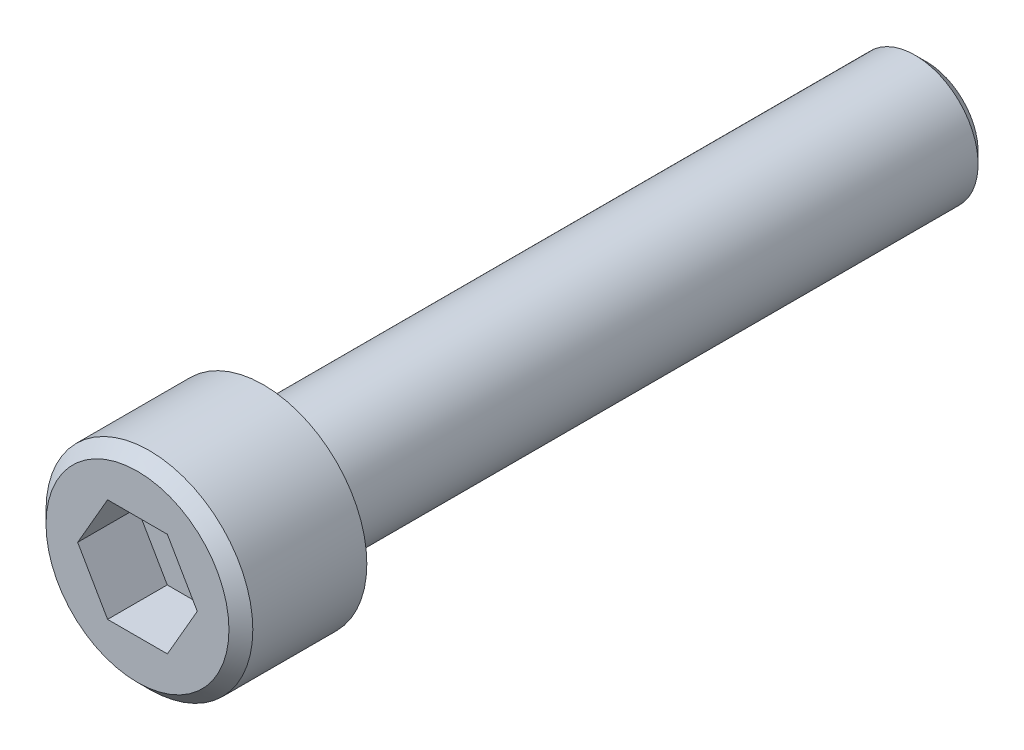
ISO-10303-21;
HEADER;
FILE_DESCRIPTION(('STEP AP214'),'2;1');
FILE_NAME('part.step','',(''),(''),'','','');
FILE_SCHEMA(('AUTOMOTIVE_DESIGN { 1 0 10303 214 1 1 1 1 }'));
ENDSEC;
DATA;
#1=APPLICATION_CONTEXT('core data for automotive mechanical design processes');
#2=APPLICATION_PROTOCOL_DEFINITION('international standard','automotive_design',2000,#1);
#3=PRODUCT_CONTEXT('',#1,'mechanical');
#4=PRODUCT('Part','Part','',(#3));
#5=PRODUCT_RELATED_PRODUCT_CATEGORY('part','',(#4));
#6=PRODUCT_DEFINITION_FORMATION('','',#4);
#7=PRODUCT_DEFINITION_CONTEXT('part definition',#1,'design');
#8=PRODUCT_DEFINITION('design','',#6,#7);
#9=PRODUCT_DEFINITION_SHAPE('','',#8);
#10=(LENGTH_UNIT() NAMED_UNIT(*) SI_UNIT(.MILLI.,.METRE.));
#11=(NAMED_UNIT(*) PLANE_ANGLE_UNIT() SI_UNIT($,.RADIAN.));
#12=(NAMED_UNIT(*) SI_UNIT($,.STERADIAN.) SOLID_ANGLE_UNIT());
#13=UNCERTAINTY_MEASURE_WITH_UNIT(LENGTH_MEASURE(1.E-05),#10,'distance_accuracy_value','');
#14=(GEOMETRIC_REPRESENTATION_CONTEXT(3) GLOBAL_UNCERTAINTY_ASSIGNED_CONTEXT((#13)) GLOBAL_UNIT_ASSIGNED_CONTEXT((#10,
#11,#12)) REPRESENTATION_CONTEXT('',''));
#15=CARTESIAN_POINT('',(0.,0.,0.));
#16=DIRECTION('',(0.,0.,1.));
#17=DIRECTION('',(1.,0.,0.));
#18=AXIS2_PLACEMENT_3D('',#15,#16,#17);
#19=CARTESIAN_POINT('',(0.,0.,4.826));
#20=DIRECTION('',(0.,0.,-1.));
#21=DIRECTION('',(-1.,0.,0.));
#22=AXIS2_PLACEMENT_3D('',#19,#20,#21);
#23=CYLINDRICAL_SURFACE('',#22,3.9624);
#24=CARTESIAN_POINT('',(0.,0.,4.3688));
#25=DIRECTION('',(0.,0.,1.));
#26=DIRECTION('',(1.,0.,0.));
#27=AXIS2_PLACEMENT_3D('',#24,#25,#26);
#28=CIRCLE('',#27,3.9624);
#29=CARTESIAN_POINT('',(3.9624,0.,4.3688));
#30=VERTEX_POINT('',#29);
#31=EDGE_CURVE('E147',#30,#30,#28,.F.);
#32=ORIENTED_EDGE('',*,*,#31,.T.);
#33=EDGE_LOOP('',(#32));
#34=FACE_BOUND('',#33,.T.);
#35=CARTESIAN_POINT('',(0.,0.,0.));
#36=DIRECTION('',(0.,0.,1.));
#37=DIRECTION('',(1.,0.,0.));
#38=AXIS2_PLACEMENT_3D('',#35,#36,#37);
#39=CIRCLE('',#38,3.9624);
#40=CARTESIAN_POINT('',(3.9624,0.,0.));
#41=VERTEX_POINT('',#40);
#42=EDGE_CURVE('E139',#41,#41,#39,.T.);
#43=ORIENTED_EDGE('',*,*,#42,.T.);
#44=EDGE_LOOP('',(#43));
#45=FACE_BOUND('',#44,.T.);
#46=ADVANCED_FACE('F17',(#34,#45),#23,.T.);
#47=CARTESIAN_POINT('',(0.,0.,4.826));
#48=DIRECTION('',(0.,0.,1.));
#49=DIRECTION('',(1.,0.,0.));
#50=AXIS2_PLACEMENT_3D('',#47,#48,#49);
#51=PLANE('',#50);
#52=CARTESIAN_POINT('',(0.,0.,4.826));
#53=DIRECTION('',(0.,0.,1.));
#54=DIRECTION('',(1.,0.,0.));
#55=AXIS2_PLACEMENT_3D('',#52,#53,#54);
#56=CIRCLE('',#55,3.5052);
#57=CARTESIAN_POINT('',(3.5052,0.,4.826));
#58=VERTEX_POINT('',#57);
#59=EDGE_CURVE('E143',#58,#58,#56,.T.);
#60=ORIENTED_EDGE('',*,*,#59,.T.);
#61=EDGE_LOOP('',(#60));
#62=FACE_BOUND('',#61,.T.);
#63=DIRECTION('',(-0.5,0.866025403784439,0.));
#64=VECTOR('',#63,1.);
#65=CARTESIAN_POINT('',(1.71851916063474,0.9921875,4.826));
#66=LINE('',#65,#64);
#67=CARTESIAN_POINT('',(2.29135888084633,0.,4.826));
#68=VERTEX_POINT('',#67);
#69=CARTESIAN_POINT('',(1.14567944042316,1.984375,4.826));
#70=VERTEX_POINT('',#69);
#71=EDGE_CURVE('E110',#68,#70,#66,.T.);
#72=ORIENTED_EDGE('',*,*,#71,.F.);
#73=DIRECTION('',(0.5,0.866025403784439,0.));
#74=VECTOR('',#73,1.);
#75=CARTESIAN_POINT('',(1.71851916063474,-0.9921875,4.826));
#76=LINE('',#75,#74);
#77=CARTESIAN_POINT('',(1.14567944042316,-1.984375,4.826));
#78=VERTEX_POINT('',#77);
#79=EDGE_CURVE('E125',#78,#68,#76,.T.);
#80=ORIENTED_EDGE('',*,*,#79,.F.);
#81=DIRECTION('',(1.,0.,0.));
#82=VECTOR('',#81,1.);
#83=CARTESIAN_POINT('',(0.,-1.984375,4.826));
#84=LINE('',#83,#82);
#85=CARTESIAN_POINT('',(-1.14567944042316,-1.984375,4.826));
#86=VERTEX_POINT('',#85);
#87=EDGE_CURVE('E34',#86,#78,#84,.T.);
#88=ORIENTED_EDGE('',*,*,#87,.F.);
#89=DIRECTION('',(0.5,-0.866025403784439,0.));
#90=VECTOR('',#89,1.);
#91=CARTESIAN_POINT('',(-1.71851916063474,-0.9921875,4.826));
#92=LINE('',#91,#90);
#93=CARTESIAN_POINT('',(-2.29135888084633,0.,4.826));
#94=VERTEX_POINT('',#93);
#95=EDGE_CURVE('E83',#94,#86,#92,.T.);
#96=ORIENTED_EDGE('',*,*,#95,.F.);
#97=DIRECTION('',(-0.5,-0.866025403784439,0.));
#98=VECTOR('',#97,1.);
#99=CARTESIAN_POINT('',(-1.71851916063474,0.9921875,4.826));
#100=LINE('',#99,#98);
#101=CARTESIAN_POINT('',(-1.14567944042316,1.984375,4.826));
#102=VERTEX_POINT('',#101);
#103=EDGE_CURVE('E117',#102,#94,#100,.T.);
#104=ORIENTED_EDGE('',*,*,#103,.F.);
#105=DIRECTION('',(-1.,0.,0.));
#106=VECTOR('',#105,1.);
#107=CARTESIAN_POINT('',(0.,1.984375,4.826));
#108=LINE('',#107,#106);
#109=EDGE_CURVE('E113',#70,#102,#108,.T.);
#110=ORIENTED_EDGE('',*,*,#109,.F.);
#111=EDGE_LOOP('',(#72,#80,#88,#96,#104,#110));
#112=FACE_BOUND('',#111,.T.);
#113=ADVANCED_FACE('F175',(#62,#112),#51,.T.);
#114=CARTESIAN_POINT('',(0.,0.,0.));
#115=DIRECTION('',(0.,0.,1.));
#116=DIRECTION('',(1.,0.,0.));
#117=AXIS2_PLACEMENT_3D('',#114,#115,#116);
#118=PLANE('',#117);
#119=CARTESIAN_POINT('',(0.,0.,0.));
#120=DIRECTION('',(0.,0.,-1.));
#121=DIRECTION('',(-1.,0.,0.));
#122=AXIS2_PLACEMENT_3D('',#119,#120,#121);
#123=CIRCLE('',#122,2.413);
#124=CARTESIAN_POINT('',(-2.413,0.,0.));
#125=VERTEX_POINT('',#124);
#126=EDGE_CURVE('E150',#125,#125,#123,.T.);
#127=ORIENTED_EDGE('',*,*,#126,.F.);
#128=EDGE_LOOP('',(#127));
#129=FACE_BOUND('',#128,.T.);
#130=ORIENTED_EDGE('',*,*,#42,.F.);
#131=EDGE_LOOP('',(#130));
#132=FACE_BOUND('',#131,.T.);
#133=ADVANCED_FACE('F181',(#129,#132),#118,.F.);
#134=CARTESIAN_POINT('',(1.71851916063474,0.9921875,2.54));
#135=DIRECTION('',(0.866025403784439,0.5,0.));
#136=DIRECTION('',(-0.5,0.866025403784439,0.));
#137=AXIS2_PLACEMENT_3D('',#134,#135,#136);
#138=PLANE('',#137);
#139=ORIENTED_EDGE('',*,*,#71,.T.);
#140=DIRECTION('',(0.,0.,1.));
#141=VECTOR('',#140,1.);
#142=CARTESIAN_POINT('',(1.14567944042316,1.984375,2.54));
#143=LINE('',#142,#141);
#144=CARTESIAN_POINT('',(1.14567944042316,1.984375,2.54));
#145=VERTEX_POINT('',#144);
#146=EDGE_CURVE('E67',#145,#70,#143,.T.);
#147=ORIENTED_EDGE('',*,*,#146,.F.);
#148=DIRECTION('',(-0.5,0.866025403784439,0.));
#149=VECTOR('',#148,1.);
#150=CARTESIAN_POINT('',(1.71851916063474,0.9921875,2.54));
#151=LINE('',#150,#149);
#152=CARTESIAN_POINT('',(2.29135888084633,0.,2.54));
#153=VERTEX_POINT('',#152);
#154=EDGE_CURVE('E127',#153,#145,#151,.T.);
#155=ORIENTED_EDGE('',*,*,#154,.F.);
#156=DIRECTION('',(0.,0.,1.));
#157=VECTOR('',#156,1.);
#158=CARTESIAN_POINT('',(2.29135888084633,0.,2.54));
#159=LINE('',#158,#157);
#160=EDGE_CURVE('E43',#153,#68,#159,.T.);
#161=ORIENTED_EDGE('',*,*,#160,.T.);
#162=EDGE_LOOP('',(#139,#147,#155,#161));
#163=FACE_BOUND('',#162,.T.);
#164=ADVANCED_FACE('F178',(#163),#138,.F.);
#165=CARTESIAN_POINT('',(0.,1.984375,2.54));
#166=DIRECTION('',(0.,1.,0.));
#167=DIRECTION('',(0.,0.,1.));
#168=AXIS2_PLACEMENT_3D('',#165,#166,#167);
#169=PLANE('',#168);
#170=ORIENTED_EDGE('',*,*,#109,.T.);
#171=DIRECTION('',(0.,0.,1.));
#172=VECTOR('',#171,1.);
#173=CARTESIAN_POINT('',(-1.14567944042316,1.984375,2.54));
#174=LINE('',#173,#172);
#175=CARTESIAN_POINT('',(-1.14567944042316,1.984375,2.54));
#176=VERTEX_POINT('',#175);
#177=EDGE_CURVE('E134',#176,#102,#174,.T.);
#178=ORIENTED_EDGE('',*,*,#177,.F.);
#179=DIRECTION('',(-1.,0.,0.));
#180=VECTOR('',#179,1.);
#181=CARTESIAN_POINT('',(0.,1.984375,2.54));
#182=LINE('',#181,#180);
#183=EDGE_CURVE('E163',#145,#176,#182,.T.);
#184=ORIENTED_EDGE('',*,*,#183,.F.);
#185=ORIENTED_EDGE('',*,*,#146,.T.);
#186=EDGE_LOOP('',(#170,#178,#184,#185));
#187=FACE_BOUND('',#186,.T.);
#188=ADVANCED_FACE('F180',(#187),#169,.F.);
#189=CARTESIAN_POINT('',(-1.71851916063474,0.9921875,2.54));
#190=DIRECTION('',(-0.866025403784439,0.5,0.));
#191=DIRECTION('',(-0.5,-0.866025403784439,0.));
#192=AXIS2_PLACEMENT_3D('',#189,#190,#191);
#193=PLANE('',#192);
#194=ORIENTED_EDGE('',*,*,#103,.T.);
#195=DIRECTION('',(0.,0.,1.));
#196=VECTOR('',#195,1.);
#197=CARTESIAN_POINT('',(-2.29135888084633,0.,2.54));
#198=LINE('',#197,#196);
#199=CARTESIAN_POINT('',(-2.29135888084633,0.,2.54));
#200=VERTEX_POINT('',#199);
#201=EDGE_CURVE('E86',#200,#94,#198,.T.);
#202=ORIENTED_EDGE('',*,*,#201,.F.);
#203=DIRECTION('',(-0.5,-0.866025403784439,0.));
#204=VECTOR('',#203,1.);
#205=CARTESIAN_POINT('',(-1.71851916063474,0.9921875,2.54));
#206=LINE('',#205,#204);
#207=EDGE_CURVE('E97',#176,#200,#206,.T.);
#208=ORIENTED_EDGE('',*,*,#207,.F.);
#209=ORIENTED_EDGE('',*,*,#177,.T.);
#210=EDGE_LOOP('',(#194,#202,#208,#209));
#211=FACE_BOUND('',#210,.T.);
#212=ADVANCED_FACE('F170',(#211),#193,.F.);
#213=CARTESIAN_POINT('',(-1.71851916063474,-0.9921875,2.54));
#214=DIRECTION('',(-0.866025403784439,-0.5,0.));
#215=DIRECTION('',(0.5,-0.866025403784439,0.));
#216=AXIS2_PLACEMENT_3D('',#213,#214,#215);
#217=PLANE('',#216);
#218=ORIENTED_EDGE('',*,*,#95,.T.);
#219=DIRECTION('',(0.,0.,1.));
#220=VECTOR('',#219,1.);
#221=CARTESIAN_POINT('',(-1.14567944042316,-1.984375,2.54));
#222=LINE('',#221,#220);
#223=CARTESIAN_POINT('',(-1.14567944042316,-1.984375,2.54));
#224=VERTEX_POINT('',#223);
#225=EDGE_CURVE('E78',#224,#86,#222,.T.);
#226=ORIENTED_EDGE('',*,*,#225,.F.);
#227=DIRECTION('',(0.5,-0.866025403784439,0.));
#228=VECTOR('',#227,1.);
#229=CARTESIAN_POINT('',(-1.71851916063474,-0.9921875,2.54));
#230=LINE('',#229,#228);
#231=EDGE_CURVE('E81',#200,#224,#230,.T.);
#232=ORIENTED_EDGE('',*,*,#231,.F.);
#233=ORIENTED_EDGE('',*,*,#201,.T.);
#234=EDGE_LOOP('',(#218,#226,#232,#233));
#235=FACE_BOUND('',#234,.T.);
#236=ADVANCED_FACE('F80',(#235),#217,.F.);
#237=CARTESIAN_POINT('',(0.,-1.984375,2.54));
#238=DIRECTION('',(0.,-1.,0.));
#239=DIRECTION('',(0.,0.,-1.));
#240=AXIS2_PLACEMENT_3D('',#237,#238,#239);
#241=PLANE('',#240);
#242=ORIENTED_EDGE('',*,*,#87,.T.);
#243=DIRECTION('',(0.,0.,1.));
#244=VECTOR('',#243,1.);
#245=CARTESIAN_POINT('',(1.14567944042316,-1.984375,2.54));
#246=LINE('',#245,#244);
#247=CARTESIAN_POINT('',(1.14567944042316,-1.984375,2.54));
#248=VERTEX_POINT('',#247);
#249=EDGE_CURVE('E87',#248,#78,#246,.T.);
#250=ORIENTED_EDGE('',*,*,#249,.F.);
#251=DIRECTION('',(1.,0.,0.));
#252=VECTOR('',#251,1.);
#253=CARTESIAN_POINT('',(0.,-1.984375,2.54));
#254=LINE('',#253,#252);
#255=EDGE_CURVE('E94',#224,#248,#254,.T.);
#256=ORIENTED_EDGE('',*,*,#255,.F.);
#257=ORIENTED_EDGE('',*,*,#225,.T.);
#258=EDGE_LOOP('',(#242,#250,#256,#257));
#259=FACE_BOUND('',#258,.T.);
#260=ADVANCED_FACE('F100',(#259),#241,.F.);
#261=CARTESIAN_POINT('',(1.71851916063474,-0.9921875,2.54));
#262=DIRECTION('',(0.866025403784438,-0.5,0.));
#263=DIRECTION('',(0.5,0.866025403784439,0.));
#264=AXIS2_PLACEMENT_3D('',#261,#262,#263);
#265=PLANE('',#264);
#266=ORIENTED_EDGE('',*,*,#79,.T.);
#267=ORIENTED_EDGE('',*,*,#160,.F.);
#268=DIRECTION('',(0.5,0.866025403784439,0.));
#269=VECTOR('',#268,1.);
#270=CARTESIAN_POINT('',(1.71851916063474,-0.9921875,2.54));
#271=LINE('',#270,#269);
#272=EDGE_CURVE('E102',#248,#153,#271,.T.);
#273=ORIENTED_EDGE('',*,*,#272,.F.);
#274=ORIENTED_EDGE('',*,*,#249,.T.);
#275=EDGE_LOOP('',(#266,#267,#273,#274));
#276=FACE_BOUND('',#275,.T.);
#277=ADVANCED_FACE('F177',(#276),#265,.F.);
#278=CARTESIAN_POINT('',(0.,0.,2.54));
#279=DIRECTION('',(0.,0.,1.));
#280=DIRECTION('',(1.,0.,0.));
#281=AXIS2_PLACEMENT_3D('',#278,#279,#280);
#282=PLANE('',#281);
#283=ORIENTED_EDGE('',*,*,#154,.T.);
#284=ORIENTED_EDGE('',*,*,#183,.T.);
#285=ORIENTED_EDGE('',*,*,#207,.T.);
#286=ORIENTED_EDGE('',*,*,#231,.T.);
#287=ORIENTED_EDGE('',*,*,#255,.T.);
#288=ORIENTED_EDGE('',*,*,#272,.T.);
#289=EDGE_LOOP('',(#283,#284,#285,#286,#287,#288));
#290=FACE_BOUND('',#289,.T.);
#291=ADVANCED_FACE('F93',(#290),#282,.T.);
#292=CARTESIAN_POINT('',(0.,0.,4.826));
#293=DIRECTION('',(0.,0.,-1.));
#294=DIRECTION('',(-1.,0.,0.));
#295=AXIS2_PLACEMENT_3D('',#292,#293,#294);
#296=CONICAL_SURFACE('',#295,3.5052,0.785398163397449);
#297=ORIENTED_EDGE('',*,*,#31,.F.);
#298=EDGE_LOOP('',(#297));
#299=FACE_BOUND('',#298,.T.);
#300=ORIENTED_EDGE('',*,*,#59,.F.);
#301=EDGE_LOOP('',(#300));
#302=FACE_BOUND('',#301,.T.);
#303=ADVANCED_FACE('F199',(#299,#302),#296,.T.);
#304=CARTESIAN_POINT('',(0.,0.,-25.4));
#305=DIRECTION('',(0.,0.,1.));
#306=DIRECTION('',(1.,0.,0.));
#307=AXIS2_PLACEMENT_3D('',#304,#305,#306);
#308=CYLINDRICAL_SURFACE('',#307,2.413);
#309=CARTESIAN_POINT('',(0.,0.,-24.9710702));
#310=DIRECTION('',(0.,0.,-1.));
#311=DIRECTION('',(-1.,0.,0.));
#312=AXIS2_PLACEMENT_3D('',#309,#310,#311);
#313=CIRCLE('',#312,2.413);
#314=CARTESIAN_POINT('',(-2.413,0.,-24.9710702));
#315=VERTEX_POINT('',#314);
#316=EDGE_CURVE('E11',#315,#315,#313,.F.);
#317=ORIENTED_EDGE('',*,*,#316,.T.);
#318=EDGE_LOOP('',(#317));
#319=FACE_BOUND('',#318,.T.);
#320=ORIENTED_EDGE('',*,*,#126,.T.);
#321=EDGE_LOOP('',(#320));
#322=FACE_BOUND('',#321,.T.);
#323=ADVANCED_FACE('F204',(#319,#322),#308,.T.);
#324=CARTESIAN_POINT('',(0.,0.,-25.4));
#325=DIRECTION('',(0.,0.,-1.));
#326=DIRECTION('',(1.,0.,0.));
#327=AXIS2_PLACEMENT_3D('',#324,#325,#326);
#328=PLANE('',#327);
#329=CARTESIAN_POINT('',(0.,0.,-25.4));
#330=DIRECTION('',(0.,0.,-1.));
#331=DIRECTION('',(-1.,0.,0.));
#332=AXIS2_PLACEMENT_3D('',#329,#330,#331);
#333=CIRCLE('',#332,1.9840702);
#334=CARTESIAN_POINT('',(-1.9840702,0.,-25.4));
#335=VERTEX_POINT('',#334);
#336=EDGE_CURVE('E27',#335,#335,#333,.T.);
#337=ORIENTED_EDGE('',*,*,#336,.T.);
#338=EDGE_LOOP('',(#337));
#339=FACE_BOUND('',#338,.T.);
#340=ADVANCED_FACE('F209',(#339),#328,.T.);
#341=CARTESIAN_POINT('',(0.,0.,-25.4));
#342=DIRECTION('',(0.,0.,1.));
#343=DIRECTION('',(1.,0.,0.));
#344=AXIS2_PLACEMENT_3D('',#341,#342,#343);
#345=CONICAL_SURFACE('',#344,1.9840702,0.78539816339745);
#346=ORIENTED_EDGE('',*,*,#316,.F.);
#347=EDGE_LOOP('',(#346));
#348=FACE_BOUND('',#347,.T.);
#349=ORIENTED_EDGE('',*,*,#336,.F.);
#350=EDGE_LOOP('',(#349));
#351=FACE_BOUND('',#350,.T.);
#352=ADVANCED_FACE('F20',(#348,#351),#345,.T.);
#353=CLOSED_SHELL('',(#46,#113,#133,#164,#188,#212,#236,#260,#277,#291,#303,#323,#340,#352));
#354=MANIFOLD_SOLID_BREP('B1',#353);
#355=ADVANCED_BREP_SHAPE_REPRESENTATION('',(#18,#354),#14);
#356=SHAPE_DEFINITION_REPRESENTATION(#9,#355);
ENDSEC;
END-ISO-10303-21;
